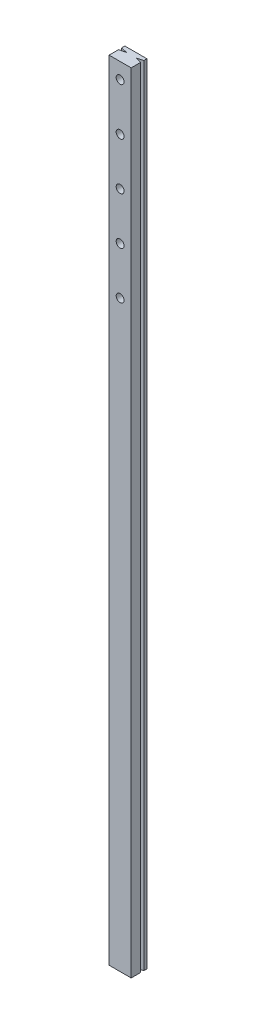
ISO-10303-21;
HEADER;
FILE_DESCRIPTION(('STEP AP214'),'2;1');
FILE_NAME('part.step','',(''),(''),'','','');
FILE_SCHEMA(('AUTOMOTIVE_DESIGN { 1 0 10303 214 1 1 1 1 }'));
ENDSEC;
DATA;
#1=APPLICATION_CONTEXT('core data for automotive mechanical design processes');
#2=APPLICATION_PROTOCOL_DEFINITION('international standard','automotive_design',2000,#1);
#3=PRODUCT_CONTEXT('',#1,'mechanical');
#4=PRODUCT('Part','Part','',(#3));
#5=PRODUCT_RELATED_PRODUCT_CATEGORY('part','',(#4));
#6=PRODUCT_DEFINITION_FORMATION('','',#4);
#7=PRODUCT_DEFINITION_CONTEXT('part definition',#1,'design');
#8=PRODUCT_DEFINITION('design','',#6,#7);
#9=PRODUCT_DEFINITION_SHAPE('','',#8);
#10=(LENGTH_UNIT() NAMED_UNIT(*) SI_UNIT(.MILLI.,.METRE.));
#11=(NAMED_UNIT(*) PLANE_ANGLE_UNIT() SI_UNIT($,.RADIAN.));
#12=(NAMED_UNIT(*) SI_UNIT($,.STERADIAN.) SOLID_ANGLE_UNIT());
#13=UNCERTAINTY_MEASURE_WITH_UNIT(LENGTH_MEASURE(1.E-05),#10,'distance_accuracy_value','');
#14=(GEOMETRIC_REPRESENTATION_CONTEXT(3) GLOBAL_UNCERTAINTY_ASSIGNED_CONTEXT((#13)) GLOBAL_UNIT_ASSIGNED_CONTEXT((#10,
#11,#12)) REPRESENTATION_CONTEXT('',''));
#15=CARTESIAN_POINT('',(0.,0.,0.));
#16=DIRECTION('',(0.,0.,1.));
#17=DIRECTION('',(1.,0.,0.));
#18=AXIS2_PLACEMENT_3D('',#15,#16,#17);
#19=CARTESIAN_POINT('',(3.50000000000002,250.,-1.5));
#20=DIRECTION('',(-1.,0.,0.));
#21=DIRECTION('',(0.,0.,1.));
#22=AXIS2_PLACEMENT_3D('',#19,#20,#21);
#23=PLANE('',#22);
#24=DIRECTION('',(0.,0.,-1.));
#25=VECTOR('',#24,1.);
#26=CARTESIAN_POINT('',(3.50000000000002,0.,-1.5));
#27=LINE('',#26,#25);
#28=CARTESIAN_POINT('',(3.50000000000002,0.,-1.5));
#29=VERTEX_POINT('',#28);
#30=CARTESIAN_POINT('',(3.5,0.,-2.5));
#31=VERTEX_POINT('',#30);
#32=EDGE_CURVE('E145',#29,#31,#27,.T.);
#33=ORIENTED_EDGE('',*,*,#32,.T.);
#34=DIRECTION('',(0.,-1.,0.));
#35=VECTOR('',#34,1.);
#36=CARTESIAN_POINT('',(3.5,250.,-2.5));
#37=LINE('',#36,#35);
#38=CARTESIAN_POINT('',(3.5,250.,-2.5));
#39=VERTEX_POINT('',#38);
#40=EDGE_CURVE('E183',#39,#31,#37,.T.);
#41=ORIENTED_EDGE('',*,*,#40,.F.);
#42=DIRECTION('',(0.,0.,-1.));
#43=VECTOR('',#42,1.);
#44=CARTESIAN_POINT('',(3.50000000000002,250.,-1.5));
#45=LINE('',#44,#43);
#46=CARTESIAN_POINT('',(3.50000000000002,250.,-1.5));
#47=VERTEX_POINT('',#46);
#48=EDGE_CURVE('E164',#47,#39,#45,.T.);
#49=ORIENTED_EDGE('',*,*,#48,.F.);
#50=DIRECTION('',(0.,-1.,0.));
#51=VECTOR('',#50,1.);
#52=CARTESIAN_POINT('',(3.50000000000002,250.,-1.5));
#53=LINE('',#52,#51);
#54=EDGE_CURVE('E141',#47,#29,#53,.T.);
#55=ORIENTED_EDGE('',*,*,#54,.T.);
#56=EDGE_LOOP('',(#33,#41,#49,#55));
#57=FACE_BOUND('',#56,.T.);
#58=ADVANCED_FACE('F35',(#57),#23,.F.);
#59=CARTESIAN_POINT('',(-3.5,250.,-2.5));
#60=DIRECTION('',(0.,0.,1.));
#61=DIRECTION('',(1.,0.,0.));
#62=AXIS2_PLACEMENT_3D('',#59,#60,#61);
#63=PLANE('',#62);
#64=CARTESIAN_POINT('',(0.,230.,-2.5));
#65=DIRECTION('',(0.,0.,-1.));
#66=DIRECTION('',(-1.,0.,0.));
#67=AXIS2_PLACEMENT_3D('',#64,#65,#66);
#68=CIRCLE('',#67,1.25);
#69=CARTESIAN_POINT('',(-1.25,230.,-2.5));
#70=VERTEX_POINT('',#69);
#71=EDGE_CURVE('E290',#70,#70,#68,.T.);
#72=ORIENTED_EDGE('',*,*,#71,.F.);
#73=EDGE_LOOP('',(#72));
#74=FACE_BOUND('',#73,.T.);
#75=CARTESIAN_POINT('',(0.,245.,-2.5));
#76=DIRECTION('',(0.,0.,-1.));
#77=DIRECTION('',(-1.,0.,0.));
#78=AXIS2_PLACEMENT_3D('',#75,#76,#77);
#79=CIRCLE('',#78,1.25);
#80=CARTESIAN_POINT('',(-1.25,245.,-2.5));
#81=VERTEX_POINT('',#80);
#82=EDGE_CURVE('E287',#81,#81,#79,.T.);
#83=ORIENTED_EDGE('',*,*,#82,.F.);
#84=EDGE_LOOP('',(#83));
#85=FACE_BOUND('',#84,.T.);
#86=DIRECTION('',(-1.,0.,0.));
#87=VECTOR('',#86,1.);
#88=CARTESIAN_POINT('',(-3.5,0.,-2.5));
#89=LINE('',#88,#87);
#90=CARTESIAN_POINT('',(-3.5,0.,-2.5));
#91=VERTEX_POINT('',#90);
#92=EDGE_CURVE('E148',#31,#91,#89,.T.);
#93=ORIENTED_EDGE('',*,*,#92,.T.);
#94=DIRECTION('',(0.,-1.,0.));
#95=VECTOR('',#94,1.);
#96=CARTESIAN_POINT('',(-3.5,250.,-2.5));
#97=LINE('',#96,#95);
#98=CARTESIAN_POINT('',(-3.5,250.,-2.5));
#99=VERTEX_POINT('',#98);
#100=EDGE_CURVE('E180',#99,#91,#97,.T.);
#101=ORIENTED_EDGE('',*,*,#100,.F.);
#102=DIRECTION('',(-1.,0.,0.));
#103=VECTOR('',#102,1.);
#104=CARTESIAN_POINT('',(-3.5,250.,-2.5));
#105=LINE('',#104,#103);
#106=EDGE_CURVE('E102',#39,#99,#105,.T.);
#107=ORIENTED_EDGE('',*,*,#106,.F.);
#108=ORIENTED_EDGE('',*,*,#40,.T.);
#109=EDGE_LOOP('',(#93,#101,#107,#108));
#110=FACE_BOUND('',#109,.T.);
#111=CARTESIAN_POINT('',(0.,215.,-2.5));
#112=DIRECTION('',(0.,0.,-1.));
#113=DIRECTION('',(-1.,0.,0.));
#114=AXIS2_PLACEMENT_3D('',#111,#112,#113);
#115=CIRCLE('',#114,1.25);
#116=CARTESIAN_POINT('',(-1.25,215.,-2.5));
#117=VERTEX_POINT('',#116);
#118=EDGE_CURVE('E188',#117,#117,#115,.T.);
#119=ORIENTED_EDGE('',*,*,#118,.F.);
#120=EDGE_LOOP('',(#119));
#121=FACE_BOUND('',#120,.T.);
#122=CARTESIAN_POINT('',(0.,200.,-2.5));
#123=DIRECTION('',(0.,0.,-1.));
#124=DIRECTION('',(-1.,0.,0.));
#125=AXIS2_PLACEMENT_3D('',#122,#123,#124);
#126=CIRCLE('',#125,1.25);
#127=CARTESIAN_POINT('',(-1.25,200.,-2.5));
#128=VERTEX_POINT('',#127);
#129=EDGE_CURVE('E194',#128,#128,#126,.T.);
#130=ORIENTED_EDGE('',*,*,#129,.F.);
#131=EDGE_LOOP('',(#130));
#132=FACE_BOUND('',#131,.T.);
#133=CARTESIAN_POINT('',(0.,185.,-2.5));
#134=DIRECTION('',(0.,0.,-1.));
#135=DIRECTION('',(-1.,0.,0.));
#136=AXIS2_PLACEMENT_3D('',#133,#134,#135);
#137=CIRCLE('',#136,1.25);
#138=CARTESIAN_POINT('',(-1.25,185.,-2.5));
#139=VERTEX_POINT('',#138);
#140=EDGE_CURVE('E11',#139,#139,#137,.T.);
#141=ORIENTED_EDGE('',*,*,#140,.F.);
#142=EDGE_LOOP('',(#141));
#143=FACE_BOUND('',#142,.T.);
#144=ADVANCED_FACE('F206',(#74,#85,#110,#121,#132,#143),#63,.F.);
#145=CARTESIAN_POINT('',(-3.5,250.,-1.5));
#146=DIRECTION('',(1.,0.,0.));
#147=DIRECTION('',(0.,0.,-1.));
#148=AXIS2_PLACEMENT_3D('',#145,#146,#147);
#149=PLANE('',#148);
#150=DIRECTION('',(0.,0.,1.));
#151=VECTOR('',#150,1.);
#152=CARTESIAN_POINT('',(-3.5,0.,-1.5));
#153=LINE('',#152,#151);
#154=CARTESIAN_POINT('',(-3.5,0.,-1.5));
#155=VERTEX_POINT('',#154);
#156=EDGE_CURVE('E151',#91,#155,#153,.T.);
#157=ORIENTED_EDGE('',*,*,#156,.T.);
#158=DIRECTION('',(0.,-1.,0.));
#159=VECTOR('',#158,1.);
#160=CARTESIAN_POINT('',(-3.5,250.,-1.5));
#161=LINE('',#160,#159);
#162=CARTESIAN_POINT('',(-3.5,250.,-1.5));
#163=VERTEX_POINT('',#162);
#164=EDGE_CURVE('E177',#163,#155,#161,.T.);
#165=ORIENTED_EDGE('',*,*,#164,.F.);
#166=DIRECTION('',(0.,0.,1.));
#167=VECTOR('',#166,1.);
#168=CARTESIAN_POINT('',(-3.5,250.,-1.5));
#169=LINE('',#168,#167);
#170=EDGE_CURVE('E283',#99,#163,#169,.T.);
#171=ORIENTED_EDGE('',*,*,#170,.F.);
#172=ORIENTED_EDGE('',*,*,#100,.T.);
#173=EDGE_LOOP('',(#157,#165,#171,#172));
#174=FACE_BOUND('',#173,.T.);
#175=ADVANCED_FACE('F208',(#174),#149,.F.);
#176=CARTESIAN_POINT('',(-3.5,250.,-1.5));
#177=DIRECTION('',(0.242535625036333,0.,-0.970142500145332));
#178=DIRECTION('',(-0.970142500145332,0.,-0.242535625036333));
#179=AXIS2_PLACEMENT_3D('',#176,#177,#178);
#180=PLANE('',#179);
#181=DIRECTION('',(0.970142500145332,0.,0.242535625036333));
#182=VECTOR('',#181,1.);
#183=CARTESIAN_POINT('',(-3.5,0.,-1.5));
#184=LINE('',#183,#182);
#185=CARTESIAN_POINT('',(-1.5,0.,-0.999999999999999));
#186=VERTEX_POINT('',#185);
#187=EDGE_CURVE('E153',#155,#186,#184,.T.);
#188=ORIENTED_EDGE('',*,*,#187,.T.);
#189=DIRECTION('',(0.,-1.,0.));
#190=VECTOR('',#189,1.);
#191=CARTESIAN_POINT('',(-1.5,250.,-0.999999999999999));
#192=LINE('',#191,#190);
#193=CARTESIAN_POINT('',(-1.5,250.,-0.999999999999999));
#194=VERTEX_POINT('',#193);
#195=EDGE_CURVE('E174',#194,#186,#192,.T.);
#196=ORIENTED_EDGE('',*,*,#195,.F.);
#197=DIRECTION('',(0.970142500145332,0.,0.242535625036333));
#198=VECTOR('',#197,1.);
#199=CARTESIAN_POINT('',(-3.5,250.,-1.5));
#200=LINE('',#199,#198);
#201=EDGE_CURVE('E281',#163,#194,#200,.T.);
#202=ORIENTED_EDGE('',*,*,#201,.F.);
#203=ORIENTED_EDGE('',*,*,#164,.T.);
#204=EDGE_LOOP('',(#188,#196,#202,#203));
#205=FACE_BOUND('',#204,.T.);
#206=ADVANCED_FACE('F215',(#205),#180,.F.);
#207=CARTESIAN_POINT('',(-1.5,250.,-0.999999999999999));
#208=DIRECTION('',(0.242535625036333,0.,0.970142500145332));
#209=DIRECTION('',(0.970142500145332,0.,-0.242535625036333));
#210=AXIS2_PLACEMENT_3D('',#207,#208,#209);
#211=PLANE('',#210);
#212=DIRECTION('',(-0.970142500145332,0.,0.242535625036333));
#213=VECTOR('',#212,1.);
#214=CARTESIAN_POINT('',(-1.5,0.,-0.999999999999999));
#215=LINE('',#214,#213);
#216=CARTESIAN_POINT('',(-3.5,0.,-0.499999999999998));
#217=VERTEX_POINT('',#216);
#218=EDGE_CURVE('E155',#186,#217,#215,.T.);
#219=ORIENTED_EDGE('',*,*,#218,.T.);
#220=DIRECTION('',(0.,-1.,0.));
#221=VECTOR('',#220,1.);
#222=CARTESIAN_POINT('',(-3.5,250.,-0.499999999999998));
#223=LINE('',#222,#221);
#224=CARTESIAN_POINT('',(-3.5,250.,-0.499999999999998));
#225=VERTEX_POINT('',#224);
#226=EDGE_CURVE('E171',#225,#217,#223,.T.);
#227=ORIENTED_EDGE('',*,*,#226,.F.);
#228=DIRECTION('',(-0.970142500145332,0.,0.242535625036333));
#229=VECTOR('',#228,1.);
#230=CARTESIAN_POINT('',(-1.5,250.,-0.999999999999999));
#231=LINE('',#230,#229);
#232=EDGE_CURVE('E268',#194,#225,#231,.T.);
#233=ORIENTED_EDGE('',*,*,#232,.F.);
#234=ORIENTED_EDGE('',*,*,#195,.T.);
#235=EDGE_LOOP('',(#219,#227,#233,#234));
#236=FACE_BOUND('',#235,.T.);
#237=ADVANCED_FACE('F246',(#236),#211,.F.);
#238=CARTESIAN_POINT('',(-3.5,250.,2.5));
#239=DIRECTION('',(1.,0.,0.));
#240=DIRECTION('',(0.,0.,-1.));
#241=AXIS2_PLACEMENT_3D('',#238,#239,#240);
#242=PLANE('',#241);
#243=DIRECTION('',(0.,0.,1.));
#244=VECTOR('',#243,1.);
#245=CARTESIAN_POINT('',(-3.5,0.,2.5));
#246=LINE('',#245,#244);
#247=CARTESIAN_POINT('',(-3.5,0.,2.5));
#248=VERTEX_POINT('',#247);
#249=EDGE_CURVE('E157',#217,#248,#246,.T.);
#250=ORIENTED_EDGE('',*,*,#249,.T.);
#251=DIRECTION('',(0.,-1.,0.));
#252=VECTOR('',#251,1.);
#253=CARTESIAN_POINT('',(-3.5,250.,2.5));
#254=LINE('',#253,#252);
#255=CARTESIAN_POINT('',(-3.5,250.,2.5));
#256=VERTEX_POINT('',#255);
#257=EDGE_CURVE('E168',#256,#248,#254,.T.);
#258=ORIENTED_EDGE('',*,*,#257,.F.);
#259=DIRECTION('',(0.,0.,1.));
#260=VECTOR('',#259,1.);
#261=CARTESIAN_POINT('',(-3.5,250.,2.5));
#262=LINE('',#261,#260);
#263=EDGE_CURVE('E277',#225,#256,#262,.T.);
#264=ORIENTED_EDGE('',*,*,#263,.F.);
#265=ORIENTED_EDGE('',*,*,#226,.T.);
#266=EDGE_LOOP('',(#250,#258,#264,#265));
#267=FACE_BOUND('',#266,.T.);
#268=ADVANCED_FACE('F238',(#267),#242,.F.);
#269=CARTESIAN_POINT('',(-3.5,250.,2.5));
#270=DIRECTION('',(0.,0.,-1.));
#271=DIRECTION('',(-1.,0.,0.));
#272=AXIS2_PLACEMENT_3D('',#269,#270,#271);
#273=PLANE('',#272);
#274=CARTESIAN_POINT('',(0.,230.,2.5));
#275=DIRECTION('',(0.,0.,-1.));
#276=DIRECTION('',(-1.,0.,0.));
#277=AXIS2_PLACEMENT_3D('',#274,#275,#276);
#278=CIRCLE('',#277,1.25);
#279=CARTESIAN_POINT('',(-1.25,230.,2.5));
#280=VERTEX_POINT('',#279);
#281=EDGE_CURVE('E295',#280,#280,#278,.T.);
#282=ORIENTED_EDGE('',*,*,#281,.T.);
#283=EDGE_LOOP('',(#282));
#284=FACE_BOUND('',#283,.T.);
#285=CARTESIAN_POINT('',(0.,245.,2.5));
#286=DIRECTION('',(0.,0.,-1.));
#287=DIRECTION('',(-1.,0.,0.));
#288=AXIS2_PLACEMENT_3D('',#285,#286,#287);
#289=CIRCLE('',#288,1.25);
#290=CARTESIAN_POINT('',(-1.25,245.,2.5));
#291=VERTEX_POINT('',#290);
#292=EDGE_CURVE('E149',#291,#291,#289,.T.);
#293=ORIENTED_EDGE('',*,*,#292,.T.);
#294=EDGE_LOOP('',(#293));
#295=FACE_BOUND('',#294,.T.);
#296=DIRECTION('',(1.,0.,0.));
#297=VECTOR('',#296,1.);
#298=CARTESIAN_POINT('',(-3.5,0.,2.5));
#299=LINE('',#298,#297);
#300=CARTESIAN_POINT('',(3.5,0.,2.5));
#301=VERTEX_POINT('',#300);
#302=EDGE_CURVE('E159',#248,#301,#299,.T.);
#303=ORIENTED_EDGE('',*,*,#302,.T.);
#304=DIRECTION('',(0.,-1.,0.));
#305=VECTOR('',#304,1.);
#306=CARTESIAN_POINT('',(3.5,250.,2.5));
#307=LINE('',#306,#305);
#308=CARTESIAN_POINT('',(3.5,250.,2.5));
#309=VERTEX_POINT('',#308);
#310=EDGE_CURVE('E136',#309,#301,#307,.T.);
#311=ORIENTED_EDGE('',*,*,#310,.F.);
#312=DIRECTION('',(1.,0.,0.));
#313=VECTOR('',#312,1.);
#314=CARTESIAN_POINT('',(-3.5,250.,2.5));
#315=LINE('',#314,#313);
#316=EDGE_CURVE('E127',#256,#309,#315,.T.);
#317=ORIENTED_EDGE('',*,*,#316,.F.);
#318=ORIENTED_EDGE('',*,*,#257,.T.);
#319=EDGE_LOOP('',(#303,#311,#317,#318));
#320=FACE_BOUND('',#319,.T.);
#321=CARTESIAN_POINT('',(0.,215.,2.5));
#322=DIRECTION('',(0.,0.,-1.));
#323=DIRECTION('',(-1.,0.,0.));
#324=AXIS2_PLACEMENT_3D('',#321,#322,#323);
#325=CIRCLE('',#324,1.25);
#326=CARTESIAN_POINT('',(-1.25,215.,2.5));
#327=VERTEX_POINT('',#326);
#328=EDGE_CURVE('E185',#327,#327,#325,.T.);
#329=ORIENTED_EDGE('',*,*,#328,.T.);
#330=EDGE_LOOP('',(#329));
#331=FACE_BOUND('',#330,.T.);
#332=CARTESIAN_POINT('',(0.,200.,2.5));
#333=DIRECTION('',(0.,0.,-1.));
#334=DIRECTION('',(-1.,0.,0.));
#335=AXIS2_PLACEMENT_3D('',#332,#333,#334);
#336=CIRCLE('',#335,1.25);
#337=CARTESIAN_POINT('',(-1.25,200.,2.5));
#338=VERTEX_POINT('',#337);
#339=EDGE_CURVE('E191',#338,#338,#336,.T.);
#340=ORIENTED_EDGE('',*,*,#339,.T.);
#341=EDGE_LOOP('',(#340));
#342=FACE_BOUND('',#341,.T.);
#343=CARTESIAN_POINT('',(0.,185.,2.5));
#344=DIRECTION('',(0.,0.,-1.));
#345=DIRECTION('',(-1.,0.,0.));
#346=AXIS2_PLACEMENT_3D('',#343,#344,#345);
#347=CIRCLE('',#346,1.25);
#348=CARTESIAN_POINT('',(-1.25,185.,2.5));
#349=VERTEX_POINT('',#348);
#350=EDGE_CURVE('E44',#349,#349,#347,.T.);
#351=ORIENTED_EDGE('',*,*,#350,.T.);
#352=EDGE_LOOP('',(#351));
#353=FACE_BOUND('',#352,.T.);
#354=ADVANCED_FACE('F199',(#284,#295,#320,#331,#342,#353),#273,.F.);
#355=CARTESIAN_POINT('',(3.5,250.,2.5));
#356=DIRECTION('',(-1.,0.,0.));
#357=DIRECTION('',(0.,0.,1.));
#358=AXIS2_PLACEMENT_3D('',#355,#356,#357);
#359=PLANE('',#358);
#360=DIRECTION('',(0.,0.,-1.));
#361=VECTOR('',#360,1.);
#362=CARTESIAN_POINT('',(3.5,0.,2.5));
#363=LINE('',#362,#361);
#364=CARTESIAN_POINT('',(3.50000000000002,0.,-0.499999999999999));
#365=VERTEX_POINT('',#364);
#366=EDGE_CURVE('E135',#301,#365,#363,.T.);
#367=ORIENTED_EDGE('',*,*,#366,.T.);
#368=DIRECTION('',(0.,-1.,0.));
#369=VECTOR('',#368,1.);
#370=CARTESIAN_POINT('',(3.50000000000002,250.,-0.499999999999999));
#371=LINE('',#370,#369);
#372=CARTESIAN_POINT('',(3.50000000000002,250.,-0.499999999999999));
#373=VERTEX_POINT('',#372);
#374=EDGE_CURVE('E132',#373,#365,#371,.T.);
#375=ORIENTED_EDGE('',*,*,#374,.F.);
#376=DIRECTION('',(0.,0.,-1.));
#377=VECTOR('',#376,1.);
#378=CARTESIAN_POINT('',(3.5,250.,2.5));
#379=LINE('',#378,#377);
#380=EDGE_CURVE('E121',#309,#373,#379,.T.);
#381=ORIENTED_EDGE('',*,*,#380,.F.);
#382=ORIENTED_EDGE('',*,*,#310,.T.);
#383=EDGE_LOOP('',(#367,#375,#381,#382));
#384=FACE_BOUND('',#383,.T.);
#385=ADVANCED_FACE('F133',(#384),#359,.F.);
#386=CARTESIAN_POINT('',(1.50000000000002,250.,-0.999999999999999));
#387=DIRECTION('',(-0.242535625036333,0.,0.970142500145332));
#388=DIRECTION('',(0.970142500145332,0.,0.242535625036333));
#389=AXIS2_PLACEMENT_3D('',#386,#387,#388);
#390=PLANE('',#389);
#391=DIRECTION('',(-0.970142500145332,0.,-0.242535625036333));
#392=VECTOR('',#391,1.);
#393=CARTESIAN_POINT('',(1.50000000000002,0.,-0.999999999999999));
#394=LINE('',#393,#392);
#395=CARTESIAN_POINT('',(1.50000000000002,0.,-0.999999999999999));
#396=VERTEX_POINT('',#395);
#397=EDGE_CURVE('E87',#365,#396,#394,.T.);
#398=ORIENTED_EDGE('',*,*,#397,.T.);
#399=DIRECTION('',(0.,-1.,0.));
#400=VECTOR('',#399,1.);
#401=CARTESIAN_POINT('',(1.50000000000002,250.,-0.999999999999999));
#402=LINE('',#401,#400);
#403=CARTESIAN_POINT('',(1.50000000000002,250.,-0.999999999999999));
#404=VERTEX_POINT('',#403);
#405=EDGE_CURVE('E137',#404,#396,#402,.T.);
#406=ORIENTED_EDGE('',*,*,#405,.F.);
#407=DIRECTION('',(-0.970142500145332,0.,-0.242535625036333));
#408=VECTOR('',#407,1.);
#409=CARTESIAN_POINT('',(1.50000000000002,250.,-0.999999999999999));
#410=LINE('',#409,#408);
#411=EDGE_CURVE('E125',#373,#404,#410,.T.);
#412=ORIENTED_EDGE('',*,*,#411,.F.);
#413=ORIENTED_EDGE('',*,*,#374,.T.);
#414=EDGE_LOOP('',(#398,#406,#412,#413));
#415=FACE_BOUND('',#414,.T.);
#416=ADVANCED_FACE('F139',(#415),#390,.F.);
#417=CARTESIAN_POINT('',(3.50000000000002,250.,-1.5));
#418=DIRECTION('',(-0.242535625036334,0.,-0.970142500145332));
#419=DIRECTION('',(-0.970142500145332,0.,0.242535625036334));
#420=AXIS2_PLACEMENT_3D('',#417,#418,#419);
#421=PLANE('',#420);
#422=DIRECTION('',(0.970142500145332,0.,-0.242535625036334));
#423=VECTOR('',#422,1.);
#424=CARTESIAN_POINT('',(3.50000000000002,0.,-1.5));
#425=LINE('',#424,#423);
#426=EDGE_CURVE('E93',#396,#29,#425,.T.);
#427=ORIENTED_EDGE('',*,*,#426,.T.);
#428=ORIENTED_EDGE('',*,*,#54,.F.);
#429=DIRECTION('',(0.970142500145332,0.,-0.242535625036334));
#430=VECTOR('',#429,1.);
#431=CARTESIAN_POINT('',(3.50000000000002,250.,-1.5));
#432=LINE('',#431,#430);
#433=EDGE_CURVE('E52',#404,#47,#432,.T.);
#434=ORIENTED_EDGE('',*,*,#433,.F.);
#435=ORIENTED_EDGE('',*,*,#405,.T.);
#436=EDGE_LOOP('',(#427,#428,#434,#435));
#437=FACE_BOUND('',#436,.T.);
#438=ADVANCED_FACE('F310',(#437),#421,.F.);
#439=CARTESIAN_POINT('',(0.,250.,0.));
#440=DIRECTION('',(0.,-1.,0.));
#441=DIRECTION('',(0.,0.,-1.));
#442=AXIS2_PLACEMENT_3D('',#439,#440,#441);
#443=PLANE('',#442);
#444=ORIENTED_EDGE('',*,*,#48,.T.);
#445=ORIENTED_EDGE('',*,*,#106,.T.);
#446=ORIENTED_EDGE('',*,*,#170,.T.);
#447=ORIENTED_EDGE('',*,*,#201,.T.);
#448=ORIENTED_EDGE('',*,*,#232,.T.);
#449=ORIENTED_EDGE('',*,*,#263,.T.);
#450=ORIENTED_EDGE('',*,*,#316,.T.);
#451=ORIENTED_EDGE('',*,*,#380,.T.);
#452=ORIENTED_EDGE('',*,*,#411,.T.);
#453=ORIENTED_EDGE('',*,*,#433,.T.);
#454=EDGE_LOOP('',(#444,#445,#446,#447,#448,#449,#450,#451,#452,#453));
#455=FACE_BOUND('',#454,.T.);
#456=ADVANCED_FACE('F123',(#455),#443,.F.);
#457=CARTESIAN_POINT('',(0.,0.,0.));
#458=DIRECTION('',(0.,-1.,0.));
#459=DIRECTION('',(0.,0.,-1.));
#460=AXIS2_PLACEMENT_3D('',#457,#458,#459);
#461=PLANE('',#460);
#462=ORIENTED_EDGE('',*,*,#32,.F.);
#463=ORIENTED_EDGE('',*,*,#426,.F.);
#464=ORIENTED_EDGE('',*,*,#397,.F.);
#465=ORIENTED_EDGE('',*,*,#366,.F.);
#466=ORIENTED_EDGE('',*,*,#302,.F.);
#467=ORIENTED_EDGE('',*,*,#249,.F.);
#468=ORIENTED_EDGE('',*,*,#218,.F.);
#469=ORIENTED_EDGE('',*,*,#187,.F.);
#470=ORIENTED_EDGE('',*,*,#156,.F.);
#471=ORIENTED_EDGE('',*,*,#92,.F.);
#472=EDGE_LOOP('',(#462,#463,#464,#465,#466,#467,#468,#469,#470,#471));
#473=FACE_BOUND('',#472,.T.);
#474=ADVANCED_FACE('F271',(#473),#461,.T.);
#475=CARTESIAN_POINT('',(0.,245.,2.5));
#476=DIRECTION('',(0.,0.,-1.));
#477=DIRECTION('',(-1.,0.,0.));
#478=AXIS2_PLACEMENT_3D('',#475,#476,#477);
#479=CYLINDRICAL_SURFACE('',#478,1.25);
#480=ORIENTED_EDGE('',*,*,#292,.F.);
#481=EDGE_LOOP('',(#480));
#482=FACE_BOUND('',#481,.T.);
#483=ORIENTED_EDGE('',*,*,#82,.T.);
#484=EDGE_LOOP('',(#483));
#485=FACE_BOUND('',#484,.T.);
#486=ADVANCED_FACE('F300',(#482,#485),#479,.F.);
#487=CARTESIAN_POINT('',(0.,230.,2.5));
#488=DIRECTION('',(0.,0.,-1.));
#489=DIRECTION('',(-1.,0.,0.));
#490=AXIS2_PLACEMENT_3D('',#487,#488,#489);
#491=CYLINDRICAL_SURFACE('',#490,1.25);
#492=ORIENTED_EDGE('',*,*,#281,.F.);
#493=EDGE_LOOP('',(#492));
#494=FACE_BOUND('',#493,.T.);
#495=ORIENTED_EDGE('',*,*,#71,.T.);
#496=EDGE_LOOP('',(#495));
#497=FACE_BOUND('',#496,.T.);
#498=ADVANCED_FACE('F226',(#494,#497),#491,.F.);
#499=CARTESIAN_POINT('',(0.,215.,2.5));
#500=DIRECTION('',(0.,0.,-1.));
#501=DIRECTION('',(-1.,0.,0.));
#502=AXIS2_PLACEMENT_3D('',#499,#500,#501);
#503=CYLINDRICAL_SURFACE('',#502,1.25);
#504=ORIENTED_EDGE('',*,*,#328,.F.);
#505=EDGE_LOOP('',(#504));
#506=FACE_BOUND('',#505,.T.);
#507=ORIENTED_EDGE('',*,*,#118,.T.);
#508=EDGE_LOOP('',(#507));
#509=FACE_BOUND('',#508,.T.);
#510=ADVANCED_FACE('F224',(#506,#509),#503,.F.);
#511=CARTESIAN_POINT('',(0.,200.,2.5));
#512=DIRECTION('',(0.,0.,-1.));
#513=DIRECTION('',(-1.,0.,0.));
#514=AXIS2_PLACEMENT_3D('',#511,#512,#513);
#515=CYLINDRICAL_SURFACE('',#514,1.25);
#516=ORIENTED_EDGE('',*,*,#339,.F.);
#517=EDGE_LOOP('',(#516));
#518=FACE_BOUND('',#517,.T.);
#519=ORIENTED_EDGE('',*,*,#129,.T.);
#520=EDGE_LOOP('',(#519));
#521=FACE_BOUND('',#520,.T.);
#522=ADVANCED_FACE('F203',(#518,#521),#515,.F.);
#523=CARTESIAN_POINT('',(0.,185.,2.5));
#524=DIRECTION('',(0.,0.,-1.));
#525=DIRECTION('',(-1.,0.,0.));
#526=AXIS2_PLACEMENT_3D('',#523,#524,#525);
#527=CYLINDRICAL_SURFACE('',#526,1.25);
#528=ORIENTED_EDGE('',*,*,#350,.F.);
#529=EDGE_LOOP('',(#528));
#530=FACE_BOUND('',#529,.T.);
#531=ORIENTED_EDGE('',*,*,#140,.T.);
#532=EDGE_LOOP('',(#531));
#533=FACE_BOUND('',#532,.T.);
#534=ADVANCED_FACE('F37',(#530,#533),#527,.F.);
#535=CLOSED_SHELL('',(#58,#144,#175,#206,#237,#268,#354,#385,#416,#438,#456,#474,#486,#498,#510,
#522,#534));
#536=MANIFOLD_SOLID_BREP('B2',#535);
#537=ADVANCED_BREP_SHAPE_REPRESENTATION('',(#18,#536),#14);
#538=SHAPE_DEFINITION_REPRESENTATION(#9,#537);
ENDSEC;
END-ISO-10303-21;
